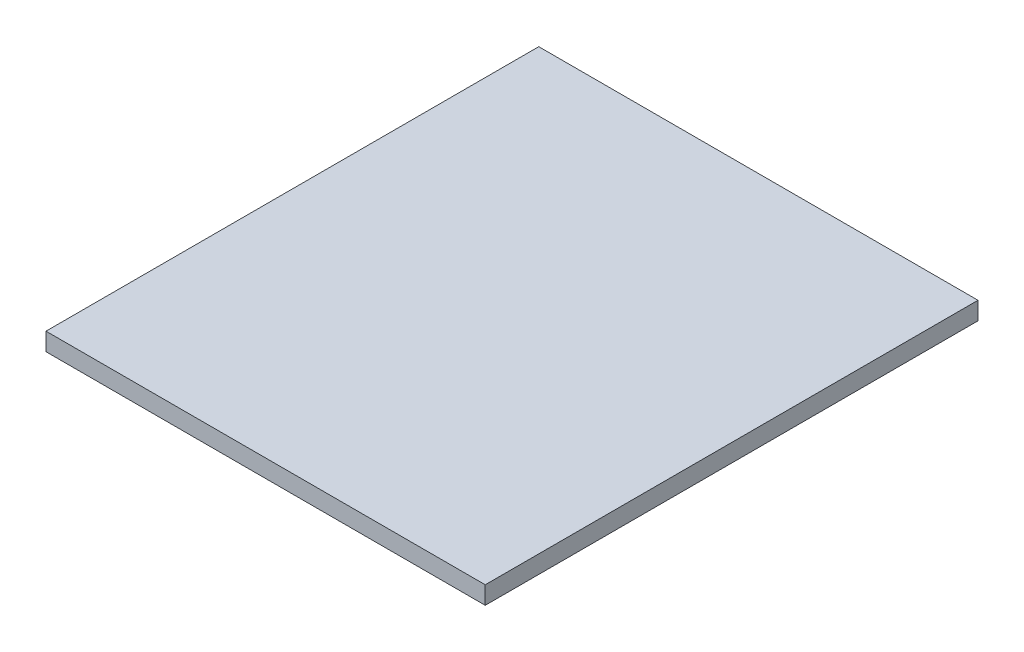
ISO-10303-21;
HEADER;
FILE_DESCRIPTION(('STEP AP214'),'2;1');
FILE_NAME('part.step','',(''),(''),'','','');
FILE_SCHEMA(('AUTOMOTIVE_DESIGN { 1 0 10303 214 1 1 1 1 }'));
ENDSEC;
DATA;
#1=APPLICATION_CONTEXT('core data for automotive mechanical design processes');
#2=APPLICATION_PROTOCOL_DEFINITION('international standard','automotive_design',2000,#1);
#3=PRODUCT_CONTEXT('',#1,'mechanical');
#4=PRODUCT('Part','Part','',(#3));
#5=PRODUCT_RELATED_PRODUCT_CATEGORY('part','',(#4));
#6=PRODUCT_DEFINITION_FORMATION('','',#4);
#7=PRODUCT_DEFINITION_CONTEXT('part definition',#1,'design');
#8=PRODUCT_DEFINITION('design','',#6,#7);
#9=PRODUCT_DEFINITION_SHAPE('','',#8);
#10=(LENGTH_UNIT() NAMED_UNIT(*) SI_UNIT(.MILLI.,.METRE.));
#11=(NAMED_UNIT(*) PLANE_ANGLE_UNIT() SI_UNIT($,.RADIAN.));
#12=(NAMED_UNIT(*) SI_UNIT($,.STERADIAN.) SOLID_ANGLE_UNIT());
#13=UNCERTAINTY_MEASURE_WITH_UNIT(LENGTH_MEASURE(1.E-05),#10,'distance_accuracy_value','');
#14=(GEOMETRIC_REPRESENTATION_CONTEXT(3) GLOBAL_UNCERTAINTY_ASSIGNED_CONTEXT((#13)) GLOBAL_UNIT_ASSIGNED_CONTEXT((#10,
#11,#12)) REPRESENTATION_CONTEXT('',''));
#15=CARTESIAN_POINT('',(0.,0.,0.));
#16=DIRECTION('',(0.,0.,1.));
#17=DIRECTION('',(1.,0.,0.));
#18=AXIS2_PLACEMENT_3D('',#15,#16,#17);
#19=CARTESIAN_POINT('',(0.,50.8,0.));
#20=DIRECTION('',(1.,0.,0.));
#21=DIRECTION('',(0.,0.,-1.));
#22=AXIS2_PLACEMENT_3D('',#19,#20,#21);
#23=PLANE('',#22);
#24=DIRECTION('',(0.,0.,1.));
#25=VECTOR('',#24,1.);
#26=CARTESIAN_POINT('',(0.,0.,0.));
#27=LINE('',#26,#25);
#28=CARTESIAN_POINT('',(0.,0.,0.));
#29=VERTEX_POINT('',#28);
#30=CARTESIAN_POINT('',(1.72062875280203E-13,0.,1405.));
#31=VERTEX_POINT('',#30);
#32=EDGE_CURVE('E98',#29,#31,#27,.T.);
#33=ORIENTED_EDGE('',*,*,#32,.T.);
#34=DIRECTION('',(0.,-1.,0.));
#35=VECTOR('',#34,1.);
#36=CARTESIAN_POINT('',(1.72062875280203E-13,50.8,1405.));
#37=LINE('',#36,#35);
#38=CARTESIAN_POINT('',(1.72062875280203E-13,50.8,1405.));
#39=VERTEX_POINT('',#38);
#40=EDGE_CURVE('E11',#39,#31,#37,.T.);
#41=ORIENTED_EDGE('',*,*,#40,.F.);
#42=DIRECTION('',(0.,0.,1.));
#43=VECTOR('',#42,1.);
#44=CARTESIAN_POINT('',(0.,50.8,0.));
#45=LINE('',#44,#43);
#46=CARTESIAN_POINT('',(0.,50.8,0.));
#47=VERTEX_POINT('',#46);
#48=EDGE_CURVE('E86',#47,#39,#45,.T.);
#49=ORIENTED_EDGE('',*,*,#48,.F.);
#50=DIRECTION('',(0.,-1.,0.));
#51=VECTOR('',#50,1.);
#52=CARTESIAN_POINT('',(0.,50.8,0.));
#53=LINE('',#52,#51);
#54=EDGE_CURVE('E94',#47,#29,#53,.T.);
#55=ORIENTED_EDGE('',*,*,#54,.T.);
#56=EDGE_LOOP('',(#33,#41,#49,#55));
#57=FACE_BOUND('',#56,.T.);
#58=ADVANCED_FACE('F35',(#57),#23,.F.);
#59=CARTESIAN_POINT('',(1.72062875280203E-13,50.8,1405.));
#60=DIRECTION('',(0.,0.,-1.));
#61=DIRECTION('',(-1.,0.,0.));
#62=AXIS2_PLACEMENT_3D('',#59,#60,#61);
#63=PLANE('',#62);
#64=DIRECTION('',(1.,0.,0.));
#65=VECTOR('',#64,1.);
#66=CARTESIAN_POINT('',(1.72062875280203E-13,0.,1405.));
#67=LINE('',#66,#65);
#68=CARTESIAN_POINT('',(1252.4,0.,1405.));
#69=VERTEX_POINT('',#68);
#70=EDGE_CURVE('E90',#31,#69,#67,.T.);
#71=ORIENTED_EDGE('',*,*,#70,.T.);
#72=DIRECTION('',(0.,-1.,0.));
#73=VECTOR('',#72,1.);
#74=CARTESIAN_POINT('',(1252.4,50.8,1405.));
#75=LINE('',#74,#73);
#76=CARTESIAN_POINT('',(1252.4,50.8,1405.));
#77=VERTEX_POINT('',#76);
#78=EDGE_CURVE('E43',#77,#69,#75,.T.);
#79=ORIENTED_EDGE('',*,*,#78,.F.);
#80=DIRECTION('',(1.,0.,0.));
#81=VECTOR('',#80,1.);
#82=CARTESIAN_POINT('',(1.72062875280203E-13,50.8,1405.));
#83=LINE('',#82,#81);
#84=EDGE_CURVE('E81',#39,#77,#83,.T.);
#85=ORIENTED_EDGE('',*,*,#84,.F.);
#86=ORIENTED_EDGE('',*,*,#40,.T.);
#87=EDGE_LOOP('',(#71,#79,#85,#86));
#88=FACE_BOUND('',#87,.T.);
#89=ADVANCED_FACE('F89',(#88),#63,.F.);
#90=CARTESIAN_POINT('',(1252.4,50.8,0.));
#91=DIRECTION('',(-1.,0.,0.));
#92=DIRECTION('',(0.,0.,1.));
#93=AXIS2_PLACEMENT_3D('',#90,#91,#92);
#94=PLANE('',#93);
#95=DIRECTION('',(0.,0.,-1.));
#96=VECTOR('',#95,1.);
#97=CARTESIAN_POINT('',(1252.4,0.,0.));
#98=LINE('',#97,#96);
#99=CARTESIAN_POINT('',(1252.4,0.,0.));
#100=VERTEX_POINT('',#99);
#101=EDGE_CURVE('E68',#69,#100,#98,.T.);
#102=ORIENTED_EDGE('',*,*,#101,.T.);
#103=DIRECTION('',(0.,-1.,0.));
#104=VECTOR('',#103,1.);
#105=CARTESIAN_POINT('',(1252.4,50.8,0.));
#106=LINE('',#105,#104);
#107=CARTESIAN_POINT('',(1252.4,50.8,0.));
#108=VERTEX_POINT('',#107);
#109=EDGE_CURVE('E91',#108,#100,#106,.T.);
#110=ORIENTED_EDGE('',*,*,#109,.F.);
#111=DIRECTION('',(0.,0.,-1.));
#112=VECTOR('',#111,1.);
#113=CARTESIAN_POINT('',(1252.4,50.8,0.));
#114=LINE('',#113,#112);
#115=EDGE_CURVE('E84',#77,#108,#114,.T.);
#116=ORIENTED_EDGE('',*,*,#115,.F.);
#117=ORIENTED_EDGE('',*,*,#78,.T.);
#118=EDGE_LOOP('',(#102,#110,#116,#117));
#119=FACE_BOUND('',#118,.T.);
#120=ADVANCED_FACE('F92',(#119),#94,.F.);
#121=CARTESIAN_POINT('',(0.,50.8,0.));
#122=DIRECTION('',(0.,0.,1.));
#123=DIRECTION('',(1.,0.,0.));
#124=AXIS2_PLACEMENT_3D('',#121,#122,#123);
#125=PLANE('',#124);
#126=DIRECTION('',(-1.,0.,0.));
#127=VECTOR('',#126,1.);
#128=CARTESIAN_POINT('',(0.,0.,0.));
#129=LINE('',#128,#127);
#130=EDGE_CURVE('E74',#100,#29,#129,.T.);
#131=ORIENTED_EDGE('',*,*,#130,.T.);
#132=ORIENTED_EDGE('',*,*,#54,.F.);
#133=DIRECTION('',(-1.,0.,0.));
#134=VECTOR('',#133,1.);
#135=CARTESIAN_POINT('',(0.,50.8,0.));
#136=LINE('',#135,#134);
#137=EDGE_CURVE('E51',#108,#47,#136,.T.);
#138=ORIENTED_EDGE('',*,*,#137,.F.);
#139=ORIENTED_EDGE('',*,*,#109,.T.);
#140=EDGE_LOOP('',(#131,#132,#138,#139));
#141=FACE_BOUND('',#140,.T.);
#142=ADVANCED_FACE('F105',(#141),#125,.F.);
#143=CARTESIAN_POINT('',(0.,50.8,0.));
#144=DIRECTION('',(0.,1.,0.));
#145=DIRECTION('',(0.,0.,1.));
#146=AXIS2_PLACEMENT_3D('',#143,#144,#145);
#147=PLANE('',#146);
#148=ORIENTED_EDGE('',*,*,#48,.T.);
#149=ORIENTED_EDGE('',*,*,#84,.T.);
#150=ORIENTED_EDGE('',*,*,#115,.T.);
#151=ORIENTED_EDGE('',*,*,#137,.T.);
#152=EDGE_LOOP('',(#148,#149,#150,#151));
#153=FACE_BOUND('',#152,.T.);
#154=ADVANCED_FACE('F82',(#153),#147,.T.);
#155=CARTESIAN_POINT('',(0.,0.,0.));
#156=DIRECTION('',(0.,1.,0.));
#157=DIRECTION('',(0.,0.,1.));
#158=AXIS2_PLACEMENT_3D('',#155,#156,#157);
#159=PLANE('',#158);
#160=ORIENTED_EDGE('',*,*,#32,.F.);
#161=ORIENTED_EDGE('',*,*,#130,.F.);
#162=ORIENTED_EDGE('',*,*,#101,.F.);
#163=ORIENTED_EDGE('',*,*,#70,.F.);
#164=EDGE_LOOP('',(#160,#161,#162,#163));
#165=FACE_BOUND('',#164,.T.);
#166=ADVANCED_FACE('F108',(#165),#159,.F.);
#167=CLOSED_SHELL('',(#58,#89,#120,#142,#154,#166));
#168=MANIFOLD_SOLID_BREP('B2',#167);
#169=ADVANCED_BREP_SHAPE_REPRESENTATION('',(#18,#168),#14);
#170=SHAPE_DEFINITION_REPRESENTATION(#9,#169);
ENDSEC;
END-ISO-10303-21;
